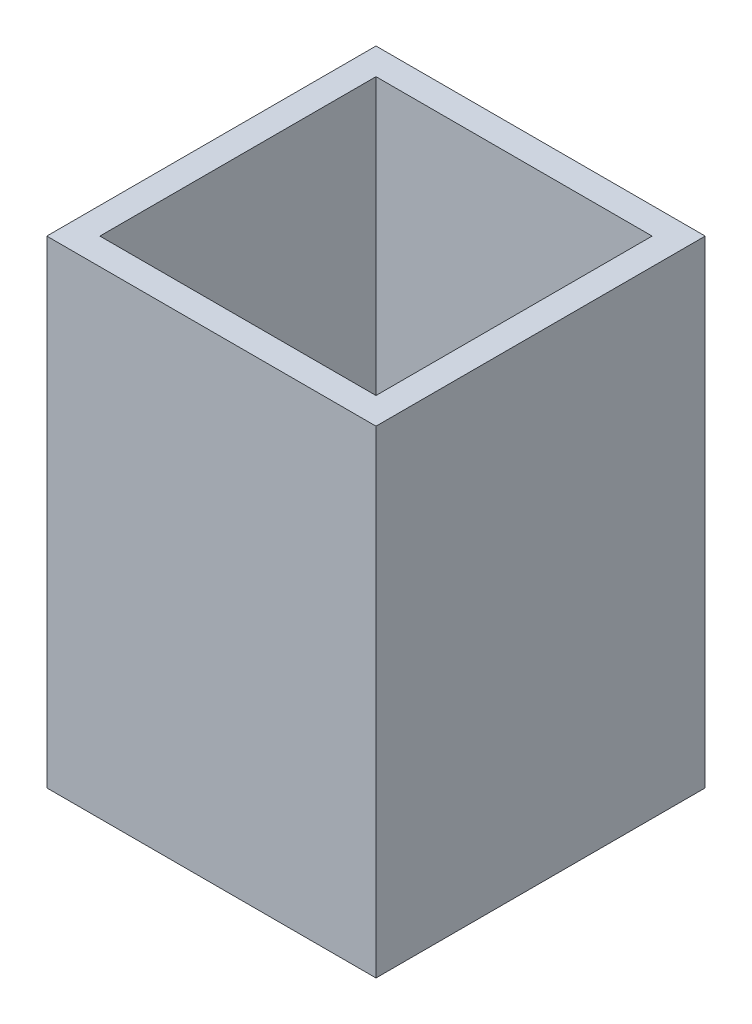
ISO-10303-21;
HEADER;
FILE_DESCRIPTION(('STEP AP214'),'2;1');
FILE_NAME('part.step','',(''),(''),'','','');
FILE_SCHEMA(('AUTOMOTIVE_DESIGN { 1 0 10303 214 1 1 1 1 }'));
ENDSEC;
DATA;
#1=APPLICATION_CONTEXT('core data for automotive mechanical design processes');
#2=APPLICATION_PROTOCOL_DEFINITION('international standard','automotive_design',2000,#1);
#3=PRODUCT_CONTEXT('',#1,'mechanical');
#4=PRODUCT('Part','Part','',(#3));
#5=PRODUCT_RELATED_PRODUCT_CATEGORY('part','',(#4));
#6=PRODUCT_DEFINITION_FORMATION('','',#4);
#7=PRODUCT_DEFINITION_CONTEXT('part definition',#1,'design');
#8=PRODUCT_DEFINITION('design','',#6,#7);
#9=PRODUCT_DEFINITION_SHAPE('','',#8);
#10=(LENGTH_UNIT() NAMED_UNIT(*) SI_UNIT(.MILLI.,.METRE.));
#11=(NAMED_UNIT(*) PLANE_ANGLE_UNIT() SI_UNIT($,.RADIAN.));
#12=(NAMED_UNIT(*) SI_UNIT($,.STERADIAN.) SOLID_ANGLE_UNIT());
#13=UNCERTAINTY_MEASURE_WITH_UNIT(LENGTH_MEASURE(1.E-05),#10,'distance_accuracy_value','');
#14=(GEOMETRIC_REPRESENTATION_CONTEXT(3) GLOBAL_UNCERTAINTY_ASSIGNED_CONTEXT((#13)) GLOBAL_UNIT_ASSIGNED_CONTEXT((#10,
#11,#12)) REPRESENTATION_CONTEXT('',''));
#15=CARTESIAN_POINT('',(0.,0.,0.));
#16=DIRECTION('',(0.,0.,1.));
#17=DIRECTION('',(1.,0.,0.));
#18=AXIS2_PLACEMENT_3D('',#15,#16,#17);
#19=CARTESIAN_POINT('',(15.5,-45.,15.5));
#20=DIRECTION('',(1.,0.,0.));
#21=DIRECTION('',(0.,0.,-1.));
#22=AXIS2_PLACEMENT_3D('',#19,#20,#21);
#23=PLANE('',#22);
#24=DIRECTION('',(0.,0.,-1.));
#25=VECTOR('',#24,1.);
#26=CARTESIAN_POINT('',(15.5,0.,15.5));
#27=LINE('',#26,#25);
#28=CARTESIAN_POINT('',(15.5,0.,15.5));
#29=VERTEX_POINT('',#28);
#30=CARTESIAN_POINT('',(15.5,0.,-15.5));
#31=VERTEX_POINT('',#30);
#32=EDGE_CURVE('E131',#29,#31,#27,.T.);
#33=ORIENTED_EDGE('',*,*,#32,.F.);
#34=DIRECTION('',(0.,1.,0.));
#35=VECTOR('',#34,1.);
#36=CARTESIAN_POINT('',(15.5,-45.,15.5));
#37=LINE('',#36,#35);
#38=CARTESIAN_POINT('',(15.5,-45.,15.5));
#39=VERTEX_POINT('',#38);
#40=EDGE_CURVE('E11',#39,#29,#37,.T.);
#41=ORIENTED_EDGE('',*,*,#40,.F.);
#42=DIRECTION('',(0.,0.,-1.));
#43=VECTOR('',#42,1.);
#44=CARTESIAN_POINT('',(15.5,-45.,15.5));
#45=LINE('',#44,#43);
#46=CARTESIAN_POINT('',(15.5,-45.,-15.5));
#47=VERTEX_POINT('',#46);
#48=EDGE_CURVE('E135',#39,#47,#45,.T.);
#49=ORIENTED_EDGE('',*,*,#48,.T.);
#50=DIRECTION('',(0.,1.,0.));
#51=VECTOR('',#50,1.);
#52=CARTESIAN_POINT('',(15.5,-45.,-15.5));
#53=LINE('',#52,#51);
#54=EDGE_CURVE('E36',#47,#31,#53,.T.);
#55=ORIENTED_EDGE('',*,*,#54,.T.);
#56=EDGE_LOOP('',(#33,#41,#49,#55));
#57=FACE_BOUND('',#56,.T.);
#58=ADVANCED_FACE('F33',(#57),#23,.T.);
#59=CARTESIAN_POINT('',(-15.5,-45.,15.5));
#60=DIRECTION('',(0.,0.,1.));
#61=DIRECTION('',(1.,0.,0.));
#62=AXIS2_PLACEMENT_3D('',#59,#60,#61);
#63=PLANE('',#62);
#64=DIRECTION('',(1.,0.,0.));
#65=VECTOR('',#64,1.);
#66=CARTESIAN_POINT('',(-15.5,0.,15.5));
#67=LINE('',#66,#65);
#68=CARTESIAN_POINT('',(-15.5,0.,15.5));
#69=VERTEX_POINT('',#68);
#70=EDGE_CURVE('E139',#69,#29,#67,.T.);
#71=ORIENTED_EDGE('',*,*,#70,.F.);
#72=DIRECTION('',(0.,1.,0.));
#73=VECTOR('',#72,1.);
#74=CARTESIAN_POINT('',(-15.5,-45.,15.5));
#75=LINE('',#74,#73);
#76=CARTESIAN_POINT('',(-15.5,-45.,15.5));
#77=VERTEX_POINT('',#76);
#78=EDGE_CURVE('E41',#77,#69,#75,.T.);
#79=ORIENTED_EDGE('',*,*,#78,.F.);
#80=DIRECTION('',(1.,0.,0.));
#81=VECTOR('',#80,1.);
#82=CARTESIAN_POINT('',(-15.5,-45.,15.5));
#83=LINE('',#82,#81);
#84=EDGE_CURVE('E145',#77,#39,#83,.T.);
#85=ORIENTED_EDGE('',*,*,#84,.T.);
#86=ORIENTED_EDGE('',*,*,#40,.T.);
#87=EDGE_LOOP('',(#71,#79,#85,#86));
#88=FACE_BOUND('',#87,.T.);
#89=ADVANCED_FACE('F171',(#88),#63,.T.);
#90=CARTESIAN_POINT('',(-15.5,-45.,15.5));
#91=DIRECTION('',(-1.,0.,0.));
#92=DIRECTION('',(0.,0.,1.));
#93=AXIS2_PLACEMENT_3D('',#90,#91,#92);
#94=PLANE('',#93);
#95=DIRECTION('',(0.,0.,1.));
#96=VECTOR('',#95,1.);
#97=CARTESIAN_POINT('',(-15.5,0.,15.5));
#98=LINE('',#97,#96);
#99=CARTESIAN_POINT('',(-15.5,0.,-15.5));
#100=VERTEX_POINT('',#99);
#101=EDGE_CURVE('E153',#100,#69,#98,.T.);
#102=ORIENTED_EDGE('',*,*,#101,.F.);
#103=DIRECTION('',(0.,1.,0.));
#104=VECTOR('',#103,1.);
#105=CARTESIAN_POINT('',(-15.5,-45.,-15.5));
#106=LINE('',#105,#104);
#107=CARTESIAN_POINT('',(-15.5,-45.,-15.5));
#108=VERTEX_POINT('',#107);
#109=EDGE_CURVE('E158',#108,#100,#106,.T.);
#110=ORIENTED_EDGE('',*,*,#109,.F.);
#111=DIRECTION('',(0.,0.,1.));
#112=VECTOR('',#111,1.);
#113=CARTESIAN_POINT('',(-15.5,-45.,15.5));
#114=LINE('',#113,#112);
#115=EDGE_CURVE('E142',#108,#77,#114,.T.);
#116=ORIENTED_EDGE('',*,*,#115,.T.);
#117=ORIENTED_EDGE('',*,*,#78,.T.);
#118=EDGE_LOOP('',(#102,#110,#116,#117));
#119=FACE_BOUND('',#118,.T.);
#120=ADVANCED_FACE('F175',(#119),#94,.T.);
#121=CARTESIAN_POINT('',(-15.5,-45.,-15.5));
#122=DIRECTION('',(0.,0.,-1.));
#123=DIRECTION('',(-1.,0.,0.));
#124=AXIS2_PLACEMENT_3D('',#121,#122,#123);
#125=PLANE('',#124);
#126=DIRECTION('',(-1.,0.,0.));
#127=VECTOR('',#126,1.);
#128=CARTESIAN_POINT('',(-15.5,0.,-15.5));
#129=LINE('',#128,#127);
#130=EDGE_CURVE('E150',#31,#100,#129,.T.);
#131=ORIENTED_EDGE('',*,*,#130,.F.);
#132=ORIENTED_EDGE('',*,*,#54,.F.);
#133=DIRECTION('',(-1.,0.,0.));
#134=VECTOR('',#133,1.);
#135=CARTESIAN_POINT('',(-15.5,-45.,-15.5));
#136=LINE('',#135,#134);
#137=EDGE_CURVE('E138',#47,#108,#136,.T.);
#138=ORIENTED_EDGE('',*,*,#137,.T.);
#139=ORIENTED_EDGE('',*,*,#109,.T.);
#140=EDGE_LOOP('',(#131,#132,#138,#139));
#141=FACE_BOUND('',#140,.T.);
#142=ADVANCED_FACE('F166',(#141),#125,.T.);
#143=CARTESIAN_POINT('',(0.,-45.,0.));
#144=DIRECTION('',(0.,-1.,0.));
#145=DIRECTION('',(0.,0.,-1.));
#146=AXIS2_PLACEMENT_3D('',#143,#144,#145);
#147=PLANE('',#146);
#148=DIRECTION('',(0.,0.,-1.));
#149=VECTOR('',#148,1.);
#150=CARTESIAN_POINT('',(13.,-45.,-13.));
#151=LINE('',#150,#149);
#152=CARTESIAN_POINT('',(13.,-45.,13.));
#153=VERTEX_POINT('',#152);
#154=CARTESIAN_POINT('',(13.,-45.,-13.));
#155=VERTEX_POINT('',#154);
#156=EDGE_CURVE('E100',#153,#155,#151,.T.);
#157=ORIENTED_EDGE('',*,*,#156,.T.);
#158=DIRECTION('',(-1.,0.,0.));
#159=VECTOR('',#158,1.);
#160=CARTESIAN_POINT('',(-13.,-45.,-13.));
#161=LINE('',#160,#159);
#162=CARTESIAN_POINT('',(-13.,-45.,-13.));
#163=VERTEX_POINT('',#162);
#164=EDGE_CURVE('E109',#155,#163,#161,.T.);
#165=ORIENTED_EDGE('',*,*,#164,.T.);
#166=DIRECTION('',(0.,0.,1.));
#167=VECTOR('',#166,1.);
#168=CARTESIAN_POINT('',(-13.,-45.,-13.));
#169=LINE('',#168,#167);
#170=CARTESIAN_POINT('',(-13.,-45.,13.));
#171=VERTEX_POINT('',#170);
#172=EDGE_CURVE('E49',#163,#171,#169,.T.);
#173=ORIENTED_EDGE('',*,*,#172,.T.);
#174=DIRECTION('',(1.,0.,0.));
#175=VECTOR('',#174,1.);
#176=CARTESIAN_POINT('',(-13.,-45.,13.));
#177=LINE('',#176,#175);
#178=EDGE_CURVE('E106',#171,#153,#177,.T.);
#179=ORIENTED_EDGE('',*,*,#178,.T.);
#180=EDGE_LOOP('',(#157,#165,#173,#179));
#181=FACE_BOUND('',#180,.T.);
#182=ORIENTED_EDGE('',*,*,#48,.F.);
#183=ORIENTED_EDGE('',*,*,#84,.F.);
#184=ORIENTED_EDGE('',*,*,#115,.F.);
#185=ORIENTED_EDGE('',*,*,#137,.F.);
#186=EDGE_LOOP('',(#182,#183,#184,#185));
#187=FACE_BOUND('',#186,.T.);
#188=ADVANCED_FACE('F113',(#181,#187),#147,.T.);
#189=CARTESIAN_POINT('',(0.,0.,0.));
#190=DIRECTION('',(0.,-1.,0.));
#191=DIRECTION('',(0.,0.,-1.));
#192=AXIS2_PLACEMENT_3D('',#189,#190,#191);
#193=PLANE('',#192);
#194=DIRECTION('',(-1.,0.,0.));
#195=VECTOR('',#194,1.);
#196=CARTESIAN_POINT('',(-13.,0.,-13.));
#197=LINE('',#196,#195);
#198=CARTESIAN_POINT('',(13.,0.,-13.));
#199=VERTEX_POINT('',#198);
#200=CARTESIAN_POINT('',(-13.,0.,-13.));
#201=VERTEX_POINT('',#200);
#202=EDGE_CURVE('E125',#199,#201,#197,.T.);
#203=ORIENTED_EDGE('',*,*,#202,.F.);
#204=DIRECTION('',(0.,0.,-1.));
#205=VECTOR('',#204,1.);
#206=CARTESIAN_POINT('',(13.,0.,-13.));
#207=LINE('',#206,#205);
#208=CARTESIAN_POINT('',(13.,0.,13.));
#209=VERTEX_POINT('',#208);
#210=EDGE_CURVE('E57',#209,#199,#207,.T.);
#211=ORIENTED_EDGE('',*,*,#210,.F.);
#212=DIRECTION('',(1.,0.,0.));
#213=VECTOR('',#212,1.);
#214=CARTESIAN_POINT('',(-13.,0.,13.));
#215=LINE('',#214,#213);
#216=CARTESIAN_POINT('',(-13.,0.,13.));
#217=VERTEX_POINT('',#216);
#218=EDGE_CURVE('E116',#217,#209,#215,.T.);
#219=ORIENTED_EDGE('',*,*,#218,.F.);
#220=DIRECTION('',(0.,0.,1.));
#221=VECTOR('',#220,1.);
#222=CARTESIAN_POINT('',(-13.,0.,-13.));
#223=LINE('',#222,#221);
#224=EDGE_CURVE('E119',#201,#217,#223,.T.);
#225=ORIENTED_EDGE('',*,*,#224,.F.);
#226=EDGE_LOOP('',(#203,#211,#219,#225));
#227=FACE_BOUND('',#226,.T.);
#228=ORIENTED_EDGE('',*,*,#32,.T.);
#229=ORIENTED_EDGE('',*,*,#130,.T.);
#230=ORIENTED_EDGE('',*,*,#101,.T.);
#231=ORIENTED_EDGE('',*,*,#70,.T.);
#232=EDGE_LOOP('',(#228,#229,#230,#231));
#233=FACE_BOUND('',#232,.T.);
#234=ADVANCED_FACE('F168',(#227,#233),#193,.F.);
#235=CARTESIAN_POINT('',(13.,-45.,-13.));
#236=DIRECTION('',(1.,0.,0.));
#237=DIRECTION('',(0.,0.,-1.));
#238=AXIS2_PLACEMENT_3D('',#235,#236,#237);
#239=PLANE('',#238);
#240=ORIENTED_EDGE('',*,*,#210,.T.);
#241=DIRECTION('',(0.,1.,0.));
#242=VECTOR('',#241,1.);
#243=CARTESIAN_POINT('',(13.,-45.,-13.));
#244=LINE('',#243,#242);
#245=EDGE_CURVE('E96',#155,#199,#244,.T.);
#246=ORIENTED_EDGE('',*,*,#245,.F.);
#247=ORIENTED_EDGE('',*,*,#156,.F.);
#248=DIRECTION('',(0.,1.,0.));
#249=VECTOR('',#248,1.);
#250=CARTESIAN_POINT('',(13.,-45.,13.));
#251=LINE('',#250,#249);
#252=EDGE_CURVE('E129',#153,#209,#251,.T.);
#253=ORIENTED_EDGE('',*,*,#252,.T.);
#254=EDGE_LOOP('',(#240,#246,#247,#253));
#255=FACE_BOUND('',#254,.T.);
#256=ADVANCED_FACE('F98',(#255),#239,.F.);
#257=CARTESIAN_POINT('',(-13.,-45.,13.));
#258=DIRECTION('',(0.,0.,1.));
#259=DIRECTION('',(1.,0.,0.));
#260=AXIS2_PLACEMENT_3D('',#257,#258,#259);
#261=PLANE('',#260);
#262=ORIENTED_EDGE('',*,*,#218,.T.);
#263=ORIENTED_EDGE('',*,*,#252,.F.);
#264=ORIENTED_EDGE('',*,*,#178,.F.);
#265=DIRECTION('',(0.,1.,0.));
#266=VECTOR('',#265,1.);
#267=CARTESIAN_POINT('',(-13.,-45.,13.));
#268=LINE('',#267,#266);
#269=EDGE_CURVE('E132',#171,#217,#268,.T.);
#270=ORIENTED_EDGE('',*,*,#269,.T.);
#271=EDGE_LOOP('',(#262,#263,#264,#270));
#272=FACE_BOUND('',#271,.T.);
#273=ADVANCED_FACE('F226',(#272),#261,.F.);
#274=CARTESIAN_POINT('',(-13.,-45.,-13.));
#275=DIRECTION('',(-1.,0.,0.));
#276=DIRECTION('',(0.,0.,1.));
#277=AXIS2_PLACEMENT_3D('',#274,#275,#276);
#278=PLANE('',#277);
#279=ORIENTED_EDGE('',*,*,#224,.T.);
#280=ORIENTED_EDGE('',*,*,#269,.F.);
#281=ORIENTED_EDGE('',*,*,#172,.F.);
#282=DIRECTION('',(0.,1.,0.));
#283=VECTOR('',#282,1.);
#284=CARTESIAN_POINT('',(-13.,-45.,-13.));
#285=LINE('',#284,#283);
#286=EDGE_CURVE('E105',#163,#201,#285,.T.);
#287=ORIENTED_EDGE('',*,*,#286,.T.);
#288=EDGE_LOOP('',(#279,#280,#281,#287));
#289=FACE_BOUND('',#288,.T.);
#290=ADVANCED_FACE('F235',(#289),#278,.F.);
#291=CARTESIAN_POINT('',(-13.,-45.,-13.));
#292=DIRECTION('',(0.,0.,-1.));
#293=DIRECTION('',(-1.,0.,0.));
#294=AXIS2_PLACEMENT_3D('',#291,#292,#293);
#295=PLANE('',#294);
#296=ORIENTED_EDGE('',*,*,#202,.T.);
#297=ORIENTED_EDGE('',*,*,#286,.F.);
#298=ORIENTED_EDGE('',*,*,#164,.F.);
#299=ORIENTED_EDGE('',*,*,#245,.T.);
#300=EDGE_LOOP('',(#296,#297,#298,#299));
#301=FACE_BOUND('',#300,.T.);
#302=ADVANCED_FACE('F110',(#301),#295,.F.);
#303=CLOSED_SHELL('',(#58,#89,#120,#142,#188,#234,#256,#273,#290,#302));
#304=MANIFOLD_SOLID_BREP('B2',#303);
#305=ADVANCED_BREP_SHAPE_REPRESENTATION('',(#18,#304),#14);
#306=SHAPE_DEFINITION_REPRESENTATION(#9,#305);
ENDSEC;
END-ISO-10303-21;
